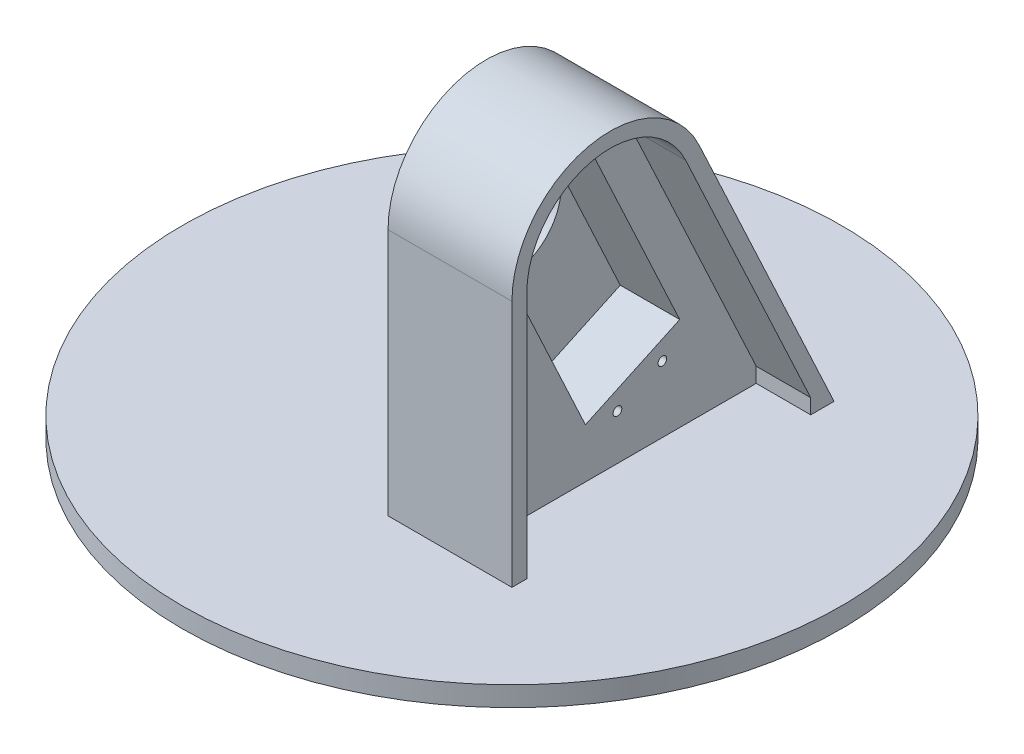
ISO-10303-21;
HEADER;
FILE_DESCRIPTION(('STEP AP214'),'2;1');
FILE_NAME('part.step','',(''),(''),'','','');
FILE_SCHEMA(('AUTOMOTIVE_DESIGN { 1 0 10303 214 1 1 1 1 }'));
ENDSEC;
DATA;
#1=APPLICATION_CONTEXT('core data for automotive mechanical design processes');
#2=APPLICATION_PROTOCOL_DEFINITION('international standard','automotive_design',2000,#1);
#3=PRODUCT_CONTEXT('',#1,'mechanical');
#4=PRODUCT('Part','Part','',(#3));
#5=PRODUCT_RELATED_PRODUCT_CATEGORY('part','',(#4));
#6=PRODUCT_DEFINITION_FORMATION('','',#4);
#7=PRODUCT_DEFINITION_CONTEXT('part definition',#1,'design');
#8=PRODUCT_DEFINITION('design','',#6,#7);
#9=PRODUCT_DEFINITION_SHAPE('','',#8);
#10=(LENGTH_UNIT() NAMED_UNIT(*) SI_UNIT(.MILLI.,.METRE.));
#11=(NAMED_UNIT(*) PLANE_ANGLE_UNIT() SI_UNIT($,.RADIAN.));
#12=(NAMED_UNIT(*) SI_UNIT($,.STERADIAN.) SOLID_ANGLE_UNIT());
#13=UNCERTAINTY_MEASURE_WITH_UNIT(LENGTH_MEASURE(1.E-05),#10,'distance_accuracy_value','');
#14=(GEOMETRIC_REPRESENTATION_CONTEXT(3) GLOBAL_UNCERTAINTY_ASSIGNED_CONTEXT((#13)) GLOBAL_UNIT_ASSIGNED_CONTEXT((#10,
#11,#12)) REPRESENTATION_CONTEXT('',''));
#15=CARTESIAN_POINT('',(0.,0.,0.));
#16=DIRECTION('',(0.,0.,1.));
#17=DIRECTION('',(1.,0.,0.));
#18=AXIS2_PLACEMENT_3D('',#15,#16,#17);
#19=CARTESIAN_POINT('',(0.,8.,0.));
#20=DIRECTION('',(0.,-1.,0.));
#21=DIRECTION('',(0.,0.,-1.));
#22=AXIS2_PLACEMENT_3D('',#19,#20,#21);
#23=PLANE('',#22);
#24=DIRECTION('',(0.,0.,-1.));
#25=VECTOR('',#24,1.);
#26=CARTESIAN_POINT('',(0.,8.,-37.));
#27=LINE('',#26,#25);
#28=CARTESIAN_POINT('',(0.,8.,-27.));
#29=VERTEX_POINT('',#28);
#30=CARTESIAN_POINT('',(0.,8.,-33.));
#31=VERTEX_POINT('',#30);
#32=EDGE_CURVE('E237',#29,#31,#27,.T.);
#33=ORIENTED_EDGE('',*,*,#32,.T.);
#34=DIRECTION('',(1.,0.,0.));
#35=VECTOR('',#34,1.);
#36=CARTESIAN_POINT('',(0.,8.,-33.));
#37=LINE('',#36,#35);
#38=CARTESIAN_POINT('',(-7.5,8.,-33.));
#39=VERTEX_POINT('',#38);
#40=EDGE_CURVE('E228',#39,#31,#37,.T.);
#41=ORIENTED_EDGE('',*,*,#40,.F.);
#42=DIRECTION('',(0.,0.,1.));
#43=VECTOR('',#42,1.);
#44=CARTESIAN_POINT('',(-7.5,8.,-27.));
#45=LINE('',#44,#43);
#46=CARTESIAN_POINT('',(-7.5,8.,-27.));
#47=VERTEX_POINT('',#46);
#48=EDGE_CURVE('E250',#39,#47,#45,.T.);
#49=ORIENTED_EDGE('',*,*,#48,.T.);
#50=DIRECTION('',(1.,0.,0.));
#51=VECTOR('',#50,1.);
#52=CARTESIAN_POINT('',(0.,8.,-27.));
#53=LINE('',#52,#51);
#54=EDGE_CURVE('E253',#47,#29,#53,.T.);
#55=ORIENTED_EDGE('',*,*,#54,.T.);
#56=EDGE_LOOP('',(#33,#41,#49,#55));
#57=FACE_BOUND('',#56,.T.);
#58=ADVANCED_FACE('F39',(#57),#23,.F.);
#59=CARTESIAN_POINT('',(0.,0.,0.));
#60=DIRECTION('',(0.,1.,0.));
#61=DIRECTION('',(0.,0.,1.));
#62=AXIS2_PLACEMENT_3D('',#59,#60,#61);
#63=PLANE('',#62);
#64=CARTESIAN_POINT('',(0.,0.,-7.25));
#65=DIRECTION('',(0.,1.,0.));
#66=DIRECTION('',(0.,0.,1.));
#67=AXIS2_PLACEMENT_3D('',#64,#65,#66);
#68=CIRCLE('',#67,0.875);
#69=CARTESIAN_POINT('',(0.,0.,-6.375));
#70=VERTEX_POINT('',#69);
#71=EDGE_CURVE('E449',#70,#70,#68,.T.);
#72=ORIENTED_EDGE('',*,*,#71,.F.);
#73=EDGE_LOOP('',(#72));
#74=FACE_BOUND('',#73,.T.);
#75=CARTESIAN_POINT('',(0.,0.,7.25));
#76=DIRECTION('',(0.,1.,0.));
#77=DIRECTION('',(0.,0.,1.));
#78=AXIS2_PLACEMENT_3D('',#75,#76,#77);
#79=CIRCLE('',#78,0.875);
#80=CARTESIAN_POINT('',(0.,0.,8.125));
#81=VERTEX_POINT('',#80);
#82=EDGE_CURVE('E462',#81,#81,#79,.T.);
#83=ORIENTED_EDGE('',*,*,#82,.F.);
#84=EDGE_LOOP('',(#83));
#85=FACE_BOUND('',#84,.T.);
#86=CARTESIAN_POINT('',(0.,0.,0.));
#87=DIRECTION('',(0.,1.,0.));
#88=DIRECTION('',(0.,0.,1.));
#89=AXIS2_PLACEMENT_3D('',#86,#87,#88);
#90=CIRCLE('',#89,3.75);
#91=CARTESIAN_POINT('',(0.,0.,3.75));
#92=VERTEX_POINT('',#91);
#93=EDGE_CURVE('E470',#92,#92,#90,.T.);
#94=ORIENTED_EDGE('',*,*,#93,.F.);
#95=EDGE_LOOP('',(#94));
#96=FACE_BOUND('',#95,.T.);
#97=CARTESIAN_POINT('',(0.,0.,0.));
#98=DIRECTION('',(0.,1.,0.));
#99=DIRECTION('',(0.,0.,1.));
#100=AXIS2_PLACEMENT_3D('',#97,#98,#99);
#101=CIRCLE('',#100,66.5);
#102=CARTESIAN_POINT('',(0.,0.,66.5));
#103=VERTEX_POINT('',#102);
#104=EDGE_CURVE('E49',#103,#103,#101,.T.);
#105=ORIENTED_EDGE('',*,*,#104,.T.);
#106=EDGE_LOOP('',(#105));
#107=FACE_BOUND('',#106,.T.);
#108=DIRECTION('',(-1.,0.,0.));
#109=VECTOR('',#108,1.);
#110=CARTESIAN_POINT('',(30.,0.,-35.));
#111=LINE('',#110,#109);
#112=CARTESIAN_POINT('',(30.,0.,-35.));
#113=VERTEX_POINT('',#112);
#114=CARTESIAN_POINT('',(5.,0.,-35.));
#115=VERTEX_POINT('',#114);
#116=EDGE_CURVE('E445',#113,#115,#111,.T.);
#117=ORIENTED_EDGE('',*,*,#116,.F.);
#118=DIRECTION('',(0.,0.,1.));
#119=VECTOR('',#118,1.);
#120=CARTESIAN_POINT('',(30.,0.,0.));
#121=LINE('',#120,#119);
#122=CARTESIAN_POINT('',(30.,0.,-30.2909432686475));
#123=VERTEX_POINT('',#122);
#124=EDGE_CURVE('E414',#113,#123,#121,.T.);
#125=ORIENTED_EDGE('',*,*,#124,.T.);
#126=DIRECTION('',(1.,0.,0.));
#127=VECTOR('',#126,1.);
#128=CARTESIAN_POINT('',(19.,0.,-30.2909432686475));
#129=LINE('',#128,#127);
#130=CARTESIAN_POINT('',(19.,0.,-30.2909432686475));
#131=VERTEX_POINT('',#130);
#132=EDGE_CURVE('E384',#131,#123,#129,.T.);
#133=ORIENTED_EDGE('',*,*,#132,.F.);
#134=DIRECTION('',(0.,0.,-1.));
#135=VECTOR('',#134,1.);
#136=CARTESIAN_POINT('',(19.,0.,27.));
#137=LINE('',#136,#135);
#138=CARTESIAN_POINT('',(19.,0.,27.));
#139=VERTEX_POINT('',#138);
#140=EDGE_CURVE('E364',#139,#131,#137,.T.);
#141=ORIENTED_EDGE('',*,*,#140,.F.);
#142=DIRECTION('',(1.,0.,0.));
#143=VECTOR('',#142,1.);
#144=CARTESIAN_POINT('',(19.,0.,27.));
#145=LINE('',#144,#143);
#146=CARTESIAN_POINT('',(30.,0.,27.));
#147=VERTEX_POINT('',#146);
#148=EDGE_CURVE('E399',#139,#147,#145,.T.);
#149=ORIENTED_EDGE('',*,*,#148,.T.);
#150=CARTESIAN_POINT('',(30.,0.,30.));
#151=VERTEX_POINT('',#150);
#152=EDGE_CURVE('E419',#147,#151,#121,.T.);
#153=ORIENTED_EDGE('',*,*,#152,.T.);
#154=DIRECTION('',(-1.,0.,0.));
#155=VECTOR('',#154,1.);
#156=CARTESIAN_POINT('',(30.,0.,30.));
#157=LINE('',#156,#155);
#158=CARTESIAN_POINT('',(5.,0.,30.));
#159=VERTEX_POINT('',#158);
#160=EDGE_CURVE('E430',#151,#159,#157,.T.);
#161=ORIENTED_EDGE('',*,*,#160,.T.);
#162=DIRECTION('',(0.,0.,-1.));
#163=VECTOR('',#162,1.);
#164=CARTESIAN_POINT('',(5.,0.,0.));
#165=LINE('',#164,#163);
#166=EDGE_CURVE('E442',#159,#115,#165,.T.);
#167=ORIENTED_EDGE('',*,*,#166,.T.);
#168=EDGE_LOOP('',(#117,#125,#133,#141,#149,#153,#161,#167));
#169=FACE_BOUND('',#168,.T.);
#170=DIRECTION('',(-1.,0.,0.));
#171=VECTOR('',#170,1.);
#172=CARTESIAN_POINT('',(-7.5,0.,-37.));
#173=LINE('',#172,#171);
#174=CARTESIAN_POINT('',(0.,0.,-37.));
#175=VERTEX_POINT('',#174);
#176=CARTESIAN_POINT('',(-7.5,0.,-37.));
#177=VERTEX_POINT('',#176);
#178=EDGE_CURVE('E259',#175,#177,#173,.T.);
#179=ORIENTED_EDGE('',*,*,#178,.F.);
#180=DIRECTION('',(0.,0.,-1.));
#181=VECTOR('',#180,1.);
#182=CARTESIAN_POINT('',(0.,0.,-37.));
#183=LINE('',#182,#181);
#184=CARTESIAN_POINT('',(0.,0.,-27.));
#185=VERTEX_POINT('',#184);
#186=EDGE_CURVE('E218',#185,#175,#183,.T.);
#187=ORIENTED_EDGE('',*,*,#186,.F.);
#188=DIRECTION('',(1.,0.,0.));
#189=VECTOR('',#188,1.);
#190=CARTESIAN_POINT('',(0.,0.,-27.));
#191=LINE('',#190,#189);
#192=CARTESIAN_POINT('',(-7.5,0.,-27.));
#193=VERTEX_POINT('',#192);
#194=EDGE_CURVE('E238',#193,#185,#191,.T.);
#195=ORIENTED_EDGE('',*,*,#194,.F.);
#196=DIRECTION('',(0.,0.,1.));
#197=VECTOR('',#196,1.);
#198=CARTESIAN_POINT('',(-7.5,0.,-27.));
#199=LINE('',#198,#197);
#200=EDGE_CURVE('E244',#177,#193,#199,.T.);
#201=ORIENTED_EDGE('',*,*,#200,.F.);
#202=EDGE_LOOP('',(#179,#187,#195,#201));
#203=FACE_BOUND('',#202,.T.);
#204=ADVANCED_FACE('F484',(#74,#85,#96,#107,#169,#203),#63,.T.);
#205=CARTESIAN_POINT('',(7.,0.,0.));
#206=DIRECTION('',(1.,0.,0.));
#207=DIRECTION('',(0.,0.,-1.));
#208=AXIS2_PLACEMENT_3D('',#205,#206,#207);
#209=PLANE('',#208);
#210=CARTESIAN_POINT('',(7.,42.0798792528952,7.54627648783785));
#211=DIRECTION('',(1.,0.,0.));
#212=DIRECTION('',(0.,0.,-1.));
#213=AXIS2_PLACEMENT_3D('',#210,#211,#212);
#214=CIRCLE('',#213,10.5);
#215=CARTESIAN_POINT('',(7.,46.5173710011725,-1.96995527604699));
#216=VERTEX_POINT('',#215);
#217=CARTESIAN_POINT('',(7.,51.59611101678,11.9837682361152));
#218=VERTEX_POINT('',#217);
#219=EDGE_CURVE('E278',#216,#218,#214,.T.);
#220=ORIENTED_EDGE('',*,*,#219,.F.);
#221=DIRECTION('',(0.,-0.906307787036651,-0.422618261740697));
#222=VECTOR('',#221,1.);
#223=CARTESIAN_POINT('',(7.,9.06282728941771,-19.4352958415393));
#224=LINE('',#223,#222);
#225=CARTESIAN_POINT('',(7.,56.0336027650573,2.46753647223033));
#226=VERTEX_POINT('',#225);
#227=EDGE_CURVE('E321',#226,#216,#224,.T.);
#228=ORIENTED_EDGE('',*,*,#227,.F.);
#229=DIRECTION('',(0.,0.422618261740697,-0.906307787036651));
#230=VECTOR('',#229,1.);
#231=CARTESIAN_POINT('',(7.,46.9707754756396,21.9028323137696));
#232=LINE('',#231,#230);
#233=EDGE_CURVE('E325',#218,#226,#232,.T.);
#234=ORIENTED_EDGE('',*,*,#233,.F.);
#235=EDGE_LOOP('',(#220,#228,#234));
#236=FACE_BOUND('',#235,.T.);
#237=ADVANCED_FACE('F507',(#236),#209,.T.);
#238=CARTESIAN_POINT('',(7.,37.6423875046179,17.0625082517227));
#239=VERTEX_POINT('',#238);
#240=EDGE_CURVE('E281',#218,#239,#214,.T.);
#241=ORIENTED_EDGE('',*,*,#240,.F.);
#242=CARTESIAN_POINT('',(7.,47.1586192685027,21.5));
#243=VERTEX_POINT('',#242);
#244=EDGE_CURVE('E326',#243,#218,#232,.T.);
#245=ORIENTED_EDGE('',*,*,#244,.F.);
#246=DIRECTION('',(0.,0.906307787036651,0.422618261740697));
#247=VECTOR('',#246,1.);
#248=CARTESIAN_POINT('',(7.,0.187843792863068,-0.402832313769615));
#249=LINE('',#248,#247);
#250=EDGE_CURVE('E330',#239,#243,#249,.T.);
#251=ORIENTED_EDGE('',*,*,#250,.F.);
#252=EDGE_LOOP('',(#241,#245,#251));
#253=FACE_BOUND('',#252,.T.);
#254=ADVANCED_FACE('F498',(#253),#209,.T.);
#255=CARTESIAN_POINT('',(19.,50.,10.1820601440891));
#256=DIRECTION('',(1.,0.,0.));
#257=DIRECTION('',(0.,0.,-1.));
#258=AXIS2_PLACEMENT_3D('',#255,#256,#257);
#259=PLANE('',#258);
#260=CARTESIAN_POINT('',(19.,52.6550969627048,17.9944710873909));
#261=DIRECTION('',(1.,0.,0.));
#262=DIRECTION('',(0.,0.,-1.));
#263=AXIS2_PLACEMENT_3D('',#260,#261,#262);
#264=CIRCLE('',#263,0.875000000000002);
#265=CARTESIAN_POINT('',(19.,52.6550969627048,17.1194710873909));
#266=VERTEX_POINT('',#265);
#267=EDGE_CURVE('E287',#266,#266,#264,.T.);
#268=ORIENTED_EDGE('',*,*,#267,.F.);
#269=EDGE_LOOP('',(#268));
#270=FACE_BOUND('',#269,.T.);
#271=CARTESIAN_POINT('',(19.,56.8812795801118,8.93139321702436));
#272=DIRECTION('',(1.,0.,0.));
#273=DIRECTION('',(0.,0.,-1.));
#274=AXIS2_PLACEMENT_3D('',#271,#272,#273);
#275=CIRCLE('',#274,0.875);
#276=CARTESIAN_POINT('',(19.,56.8812795801118,8.05639321702436));
#277=VERTEX_POINT('',#276);
#278=EDGE_CURVE('E291',#277,#277,#275,.T.);
#279=ORIENTED_EDGE('',*,*,#278,.F.);
#280=EDGE_LOOP('',(#279));
#281=FACE_BOUND('',#280,.T.);
#282=CARTESIAN_POINT('',(19.,9.15232318494556,-2.29120547616262));
#283=DIRECTION('',(1.,0.,0.));
#284=DIRECTION('',(0.,0.,-1.));
#285=AXIS2_PLACEMENT_3D('',#282,#283,#284);
#286=CIRCLE('',#285,0.875);
#287=CARTESIAN_POINT('',(19.,9.15232318494556,-3.16620547616262));
#288=VERTEX_POINT('',#287);
#289=EDGE_CURVE('E299',#288,#288,#286,.T.);
#290=ORIENTED_EDGE('',*,*,#289,.F.);
#291=EDGE_LOOP('',(#290));
#292=FACE_BOUND('',#291,.T.);
#293=CARTESIAN_POINT('',(19.,13.3785058023525,-11.3542833465291));
#294=DIRECTION('',(1.,0.,0.));
#295=DIRECTION('',(0.,0.,-1.));
#296=AXIS2_PLACEMENT_3D('',#293,#294,#295);
#297=CIRCLE('',#296,0.875);
#298=CARTESIAN_POINT('',(19.,13.3785058023525,-12.2292833465291));
#299=VERTEX_POINT('',#298);
#300=EDGE_CURVE('E307',#299,#299,#297,.T.);
#301=ORIENTED_EDGE('',*,*,#300,.F.);
#302=EDGE_LOOP('',(#301));
#303=FACE_BOUND('',#302,.T.);
#304=ORIENTED_EDGE('',*,*,#140,.T.);
#305=DIRECTION('',(0.,1.,0.));
#306=VECTOR('',#305,1.);
#307=CARTESIAN_POINT('',(19.,0.,-30.2909432686475));
#308=LINE('',#307,#306);
#309=CARTESIAN_POINT('',(19.,3.,-30.2909432686475));
#310=VERTEX_POINT('',#309);
#311=EDGE_CURVE('E368',#131,#310,#308,.T.);
#312=ORIENTED_EDGE('',*,*,#311,.T.);
#313=DIRECTION('',(0.,0.906307787036648,0.422618261740704));
#314=VECTOR('',#313,1.);
#315=CARTESIAN_POINT('',(19.,3.,-30.2909432686475));
#316=LINE('',#315,#314);
#317=CARTESIAN_POINT('',(19.,57.1075685079648,-5.06016970923695));
#318=VERTEX_POINT('',#317);
#319=EDGE_CURVE('E373',#310,#318,#316,.T.);
#320=ORIENTED_EDGE('',*,*,#319,.T.);
#321=CARTESIAN_POINT('',(19.,50.,10.1820601440891));
#322=DIRECTION('',(1.,0.,0.));
#323=DIRECTION('',(0.,0.,-1.));
#324=AXIS2_PLACEMENT_3D('',#321,#322,#323);
#325=CIRCLE('',#324,16.8179398559109);
#326=CARTESIAN_POINT('',(19.,50.,27.));
#327=VERTEX_POINT('',#326);
#328=EDGE_CURVE('E377',#318,#327,#325,.T.);
#329=ORIENTED_EDGE('',*,*,#328,.T.);
#330=DIRECTION('',(0.,-1.,0.));
#331=VECTOR('',#330,1.);
#332=CARTESIAN_POINT('',(19.,50.,27.));
#333=LINE('',#332,#331);
#334=EDGE_CURVE('E381',#327,#139,#333,.T.);
#335=ORIENTED_EDGE('',*,*,#334,.T.);
#336=EDGE_LOOP('',(#304,#312,#320,#329,#335));
#337=FACE_BOUND('',#336,.T.);
#338=DIRECTION('',(0.,-0.906307787036651,-0.422618261740697));
#339=VECTOR('',#338,1.);
#340=CARTESIAN_POINT('',(19.,9.06282728941771,-19.4352958415393));
#341=LINE('',#340,#339);
#342=CARTESIAN_POINT('',(19.,56.0336027650573,2.46753647223033));
#343=VERTEX_POINT('',#342);
#344=CARTESIAN_POINT('',(19.,18.8749834965546,-14.8598122591383));
#345=VERTEX_POINT('',#344);
#346=EDGE_CURVE('E339',#343,#345,#341,.T.);
#347=ORIENTED_EDGE('',*,*,#346,.T.);
#348=DIRECTION('',(0.,-0.422618261740697,0.906307787036651));
#349=VECTOR('',#348,1.);
#350=CARTESIAN_POINT('',(19.,9.81215620713694,4.57548358240103));
#351=LINE('',#350,#349);
#352=CARTESIAN_POINT('',(19.,10.,4.17265126863141));
#353=VERTEX_POINT('',#352);
#354=EDGE_CURVE('E286',#345,#353,#351,.T.);
#355=ORIENTED_EDGE('',*,*,#354,.T.);
#356=DIRECTION('',(0.,0.906307787036651,0.422618261740697));
#357=VECTOR('',#356,1.);
#358=CARTESIAN_POINT('',(19.,0.187843792863068,-0.402832313769615));
#359=LINE('',#358,#357);
#360=CARTESIAN_POINT('',(19.,47.1586192685027,21.5));
#361=VERTEX_POINT('',#360);
#362=EDGE_CURVE('E320',#353,#361,#359,.T.);
#363=ORIENTED_EDGE('',*,*,#362,.T.);
#364=DIRECTION('',(0.,0.422618261740697,-0.906307787036651));
#365=VECTOR('',#364,1.);
#366=CARTESIAN_POINT('',(19.,46.9707754756396,21.9028323137696));
#367=LINE('',#366,#365);
#368=EDGE_CURVE('E343',#361,#343,#367,.T.);
#369=ORIENTED_EDGE('',*,*,#368,.T.);
#370=EDGE_LOOP('',(#347,#355,#363,#369));
#371=FACE_BOUND('',#370,.T.);
#372=ADVANCED_FACE('F489',(#270,#281,#292,#303,#337,#371),#259,.T.);
#373=CARTESIAN_POINT('',(0.,-4.,0.));
#374=DIRECTION('',(0.,1.,0.));
#375=DIRECTION('',(0.,0.,1.));
#376=AXIS2_PLACEMENT_3D('',#373,#374,#375);
#377=CYLINDRICAL_SURFACE('',#376,66.5);
#378=CARTESIAN_POINT('',(0.,-4.,0.));
#379=DIRECTION('',(0.,1.,0.));
#380=DIRECTION('',(0.,0.,1.));
#381=AXIS2_PLACEMENT_3D('',#378,#379,#380);
#382=CIRCLE('',#381,66.5);
#383=CARTESIAN_POINT('',(0.,-4.,66.5));
#384=VERTEX_POINT('',#383);
#385=EDGE_CURVE('E11',#384,#384,#382,.T.);
#386=ORIENTED_EDGE('',*,*,#385,.T.);
#387=EDGE_LOOP('',(#386));
#388=FACE_BOUND('',#387,.T.);
#389=ORIENTED_EDGE('',*,*,#104,.F.);
#390=EDGE_LOOP('',(#389));
#391=FACE_BOUND('',#390,.T.);
#392=ADVANCED_FACE('F41',(#388,#391),#377,.T.);
#393=CARTESIAN_POINT('',(0.,-4.,0.));
#394=DIRECTION('',(0.,1.,0.));
#395=DIRECTION('',(0.,0.,1.));
#396=AXIS2_PLACEMENT_3D('',#393,#394,#395);
#397=PLANE('',#396);
#398=CARTESIAN_POINT('',(0.,-4.,-7.25));
#399=DIRECTION('',(0.,1.,0.));
#400=DIRECTION('',(0.,0.,1.));
#401=AXIS2_PLACEMENT_3D('',#398,#399,#400);
#402=CIRCLE('',#401,0.875);
#403=CARTESIAN_POINT('',(0.,-4.,-6.375));
#404=VERTEX_POINT('',#403);
#405=EDGE_CURVE('E458',#404,#404,#402,.T.);
#406=ORIENTED_EDGE('',*,*,#405,.T.);
#407=EDGE_LOOP('',(#406));
#408=FACE_BOUND('',#407,.T.);
#409=CARTESIAN_POINT('',(0.,-4.,7.25));
#410=DIRECTION('',(0.,1.,0.));
#411=DIRECTION('',(0.,0.,1.));
#412=AXIS2_PLACEMENT_3D('',#409,#410,#411);
#413=CIRCLE('',#412,0.875);
#414=CARTESIAN_POINT('',(0.,-4.,8.125));
#415=VERTEX_POINT('',#414);
#416=EDGE_CURVE('E466',#415,#415,#413,.T.);
#417=ORIENTED_EDGE('',*,*,#416,.T.);
#418=EDGE_LOOP('',(#417));
#419=FACE_BOUND('',#418,.T.);
#420=CARTESIAN_POINT('',(0.,-4.,0.));
#421=DIRECTION('',(0.,1.,0.));
#422=DIRECTION('',(0.,0.,1.));
#423=AXIS2_PLACEMENT_3D('',#420,#421,#422);
#424=CIRCLE('',#423,3.75);
#425=CARTESIAN_POINT('',(0.,-4.,3.75));
#426=VERTEX_POINT('',#425);
#427=EDGE_CURVE('E474',#426,#426,#424,.T.);
#428=ORIENTED_EDGE('',*,*,#427,.T.);
#429=EDGE_LOOP('',(#428));
#430=FACE_BOUND('',#429,.T.);
#431=ORIENTED_EDGE('',*,*,#385,.F.);
#432=EDGE_LOOP('',(#431));
#433=FACE_BOUND('',#432,.T.);
#434=ADVANCED_FACE('F488',(#408,#419,#430,#433),#397,.F.);
#435=CARTESIAN_POINT('',(0.,-4.,0.));
#436=DIRECTION('',(0.,1.,0.));
#437=DIRECTION('',(0.,0.,1.));
#438=AXIS2_PLACEMENT_3D('',#435,#436,#437);
#439=CYLINDRICAL_SURFACE('',#438,3.75);
#440=ORIENTED_EDGE('',*,*,#427,.F.);
#441=EDGE_LOOP('',(#440));
#442=FACE_BOUND('',#441,.T.);
#443=ORIENTED_EDGE('',*,*,#93,.T.);
#444=EDGE_LOOP('',(#443));
#445=FACE_BOUND('',#444,.T.);
#446=ADVANCED_FACE('F495',(#442,#445),#439,.F.);
#447=CARTESIAN_POINT('',(0.,-4.,7.25));
#448=DIRECTION('',(0.,1.,0.));
#449=DIRECTION('',(0.,0.,1.));
#450=AXIS2_PLACEMENT_3D('',#447,#448,#449);
#451=CYLINDRICAL_SURFACE('',#450,0.875);
#452=ORIENTED_EDGE('',*,*,#416,.F.);
#453=EDGE_LOOP('',(#452));
#454=FACE_BOUND('',#453,.T.);
#455=ORIENTED_EDGE('',*,*,#82,.T.);
#456=EDGE_LOOP('',(#455));
#457=FACE_BOUND('',#456,.T.);
#458=ADVANCED_FACE('F627',(#454,#457),#451,.F.);
#459=CARTESIAN_POINT('',(0.,-4.,-7.25));
#460=DIRECTION('',(0.,1.,0.));
#461=DIRECTION('',(0.,0.,1.));
#462=AXIS2_PLACEMENT_3D('',#459,#460,#461);
#463=CYLINDRICAL_SURFACE('',#462,0.875);
#464=ORIENTED_EDGE('',*,*,#405,.F.);
#465=EDGE_LOOP('',(#464));
#466=FACE_BOUND('',#465,.T.);
#467=ORIENTED_EDGE('',*,*,#71,.T.);
#468=EDGE_LOOP('',(#467));
#469=FACE_BOUND('',#468,.T.);
#470=ADVANCED_FACE('F617',(#466,#469),#463,.F.);
#471=CARTESIAN_POINT('',(30.,0.,-35.));
#472=DIRECTION('',(0.,-0.422618261740704,0.906307787036648));
#473=DIRECTION('',(0.,-0.906307787036648,-0.422618261740704));
#474=AXIS2_PLACEMENT_3D('',#471,#472,#473);
#475=PLANE('',#474);
#476=DIRECTION('',(0.,0.906307787036648,0.422618261740704));
#477=VECTOR('',#476,1.);
#478=CARTESIAN_POINT('',(5.,0.,-35.));
#479=LINE('',#478,#477);
#480=CARTESIAN_POINT('',(5.,58.3754232931869,-7.77909307034691));
#481=VERTEX_POINT('',#480);
#482=EDGE_CURVE('E438',#115,#481,#479,.T.);
#483=ORIENTED_EDGE('',*,*,#482,.T.);
#484=DIRECTION('',(-1.,0.,0.));
#485=VECTOR('',#484,1.);
#486=CARTESIAN_POINT('',(30.,58.3754232931869,-7.77909307034691));
#487=LINE('',#486,#485);
#488=CARTESIAN_POINT('',(30.,58.3754232931869,-7.77909307034691));
#489=VERTEX_POINT('',#488);
#490=EDGE_CURVE('E450',#489,#481,#487,.T.);
#491=ORIENTED_EDGE('',*,*,#490,.F.);
#492=DIRECTION('',(0.,0.906307787036648,0.422618261740704));
#493=VECTOR('',#492,1.);
#494=CARTESIAN_POINT('',(30.,0.,-35.));
#495=LINE('',#494,#493);
#496=EDGE_CURVE('E427',#113,#489,#495,.T.);
#497=ORIENTED_EDGE('',*,*,#496,.F.);
#498=ORIENTED_EDGE('',*,*,#116,.T.);
#499=EDGE_LOOP('',(#483,#491,#497,#498));
#500=FACE_BOUND('',#499,.T.);
#501=ADVANCED_FACE('F613',(#500),#475,.F.);
#502=CARTESIAN_POINT('',(30.,50.,10.1820601440891));
#503=DIRECTION('',(-1.,0.,0.));
#504=DIRECTION('',(0.,0.,1.));
#505=AXIS2_PLACEMENT_3D('',#502,#503,#504);
#506=CYLINDRICAL_SURFACE('',#505,19.8179398559109);
#507=CARTESIAN_POINT('',(5.,50.,10.1820601440891));
#508=DIRECTION('',(-1.,0.,0.));
#509=DIRECTION('',(0.,0.,1.));
#510=AXIS2_PLACEMENT_3D('',#507,#508,#509);
#511=CIRCLE('',#510,19.8179398559109);
#512=CARTESIAN_POINT('',(5.,50.,30.));
#513=VERTEX_POINT('',#512);
#514=EDGE_CURVE('E434',#513,#481,#511,.T.);
#515=ORIENTED_EDGE('',*,*,#514,.F.);
#516=DIRECTION('',(-1.,0.,0.));
#517=VECTOR('',#516,1.);
#518=CARTESIAN_POINT('',(30.,50.,30.));
#519=LINE('',#518,#517);
#520=CARTESIAN_POINT('',(30.,50.,30.));
#521=VERTEX_POINT('',#520);
#522=EDGE_CURVE('E453',#521,#513,#519,.T.);
#523=ORIENTED_EDGE('',*,*,#522,.F.);
#524=CARTESIAN_POINT('',(30.,50.,10.1820601440891));
#525=DIRECTION('',(-1.,0.,0.));
#526=DIRECTION('',(0.,0.,1.));
#527=AXIS2_PLACEMENT_3D('',#524,#525,#526);
#528=CIRCLE('',#527,19.8179398559109);
#529=EDGE_CURVE('E423',#521,#489,#528,.T.);
#530=ORIENTED_EDGE('',*,*,#529,.T.);
#531=ORIENTED_EDGE('',*,*,#490,.T.);
#532=EDGE_LOOP('',(#515,#523,#530,#531));
#533=FACE_BOUND('',#532,.T.);
#534=ADVANCED_FACE('F616',(#533),#506,.T.);
#535=CARTESIAN_POINT('',(30.,0.,30.));
#536=DIRECTION('',(0.,0.,1.));
#537=DIRECTION('',(1.,0.,0.));
#538=AXIS2_PLACEMENT_3D('',#535,#536,#537);
#539=PLANE('',#538);
#540=DIRECTION('',(0.,1.,0.));
#541=VECTOR('',#540,1.);
#542=CARTESIAN_POINT('',(5.,0.,30.));
#543=LINE('',#542,#541);
#544=EDGE_CURVE('E402',#159,#513,#543,.T.);
#545=ORIENTED_EDGE('',*,*,#544,.F.);
#546=ORIENTED_EDGE('',*,*,#160,.F.);
#547=DIRECTION('',(0.,1.,0.));
#548=VECTOR('',#547,1.);
#549=CARTESIAN_POINT('',(30.,0.,30.));
#550=LINE('',#549,#548);
#551=EDGE_CURVE('E418',#151,#521,#550,.T.);
#552=ORIENTED_EDGE('',*,*,#551,.T.);
#553=ORIENTED_EDGE('',*,*,#522,.T.);
#554=EDGE_LOOP('',(#545,#546,#552,#553));
#555=FACE_BOUND('',#554,.T.);
#556=ADVANCED_FACE('F608',(#555),#539,.T.);
#557=CARTESIAN_POINT('',(30.,50.,10.1820601440891));
#558=DIRECTION('',(-1.,0.,0.));
#559=DIRECTION('',(0.,0.,1.));
#560=AXIS2_PLACEMENT_3D('',#557,#558,#559);
#561=PLANE('',#560);
#562=ORIENTED_EDGE('',*,*,#152,.F.);
#563=DIRECTION('',(0.,-1.,0.));
#564=VECTOR('',#563,1.);
#565=CARTESIAN_POINT('',(30.,3.,27.));
#566=LINE('',#565,#564);
#567=CARTESIAN_POINT('',(30.,50.,27.));
#568=VERTEX_POINT('',#567);
#569=EDGE_CURVE('E369',#568,#147,#566,.T.);
#570=ORIENTED_EDGE('',*,*,#569,.F.);
#571=CARTESIAN_POINT('',(30.,50.,10.1820601440891));
#572=DIRECTION('',(1.,0.,0.));
#573=DIRECTION('',(0.,0.,-1.));
#574=AXIS2_PLACEMENT_3D('',#571,#572,#573);
#575=CIRCLE('',#574,16.8179398559109);
#576=CARTESIAN_POINT('',(30.,57.1075685079648,-5.06016970923695));
#577=VERTEX_POINT('',#576);
#578=EDGE_CURVE('E392',#577,#568,#575,.T.);
#579=ORIENTED_EDGE('',*,*,#578,.F.);
#580=DIRECTION('',(0.,0.906307787036648,0.422618261740704));
#581=VECTOR('',#580,1.);
#582=CARTESIAN_POINT('',(30.,3.,-30.2909432686475));
#583=LINE('',#582,#581);
#584=CARTESIAN_POINT('',(30.,3.,-30.2909432686475));
#585=VERTEX_POINT('',#584);
#586=EDGE_CURVE('E388',#585,#577,#583,.T.);
#587=ORIENTED_EDGE('',*,*,#586,.F.);
#588=DIRECTION('',(0.,1.,0.));
#589=VECTOR('',#588,1.);
#590=CARTESIAN_POINT('',(30.,0.,-30.2909432686475));
#591=LINE('',#590,#589);
#592=EDGE_CURVE('E354',#123,#585,#591,.T.);
#593=ORIENTED_EDGE('',*,*,#592,.F.);
#594=ORIENTED_EDGE('',*,*,#124,.F.);
#595=ORIENTED_EDGE('',*,*,#496,.T.);
#596=ORIENTED_EDGE('',*,*,#529,.F.);
#597=ORIENTED_EDGE('',*,*,#551,.F.);
#598=EDGE_LOOP('',(#562,#570,#579,#587,#593,#594,#595,#596,#597));
#599=FACE_BOUND('',#598,.T.);
#600=ADVANCED_FACE('F605',(#599),#561,.F.);
#601=CARTESIAN_POINT('',(5.,50.,10.1820601440891));
#602=DIRECTION('',(-1.,0.,0.));
#603=DIRECTION('',(0.,0.,1.));
#604=AXIS2_PLACEMENT_3D('',#601,#602,#603);
#605=PLANE('',#604);
#606=CARTESIAN_POINT('',(5.,42.0798792528952,7.54627648783785));
#607=DIRECTION('',(-1.,0.,0.));
#608=DIRECTION('',(0.,0.,1.));
#609=AXIS2_PLACEMENT_3D('',#606,#607,#608);
#610=CIRCLE('',#609,10.5);
#611=CARTESIAN_POINT('',(5.,42.0798792528952,18.0462764878379));
#612=VERTEX_POINT('',#611);
#613=EDGE_CURVE('E43',#612,#612,#610,.T.);
#614=ORIENTED_EDGE('',*,*,#613,.F.);
#615=EDGE_LOOP('',(#614));
#616=FACE_BOUND('',#615,.T.);
#617=ORIENTED_EDGE('',*,*,#166,.F.);
#618=ORIENTED_EDGE('',*,*,#544,.T.);
#619=ORIENTED_EDGE('',*,*,#514,.T.);
#620=ORIENTED_EDGE('',*,*,#482,.F.);
#621=EDGE_LOOP('',(#617,#618,#619,#620));
#622=FACE_BOUND('',#621,.T.);
#623=ADVANCED_FACE('F593',(#616,#622),#605,.T.);
#624=CARTESIAN_POINT('',(19.,3.,27.));
#625=DIRECTION('',(0.,0.,1.));
#626=DIRECTION('',(0.,-1.,0.));
#627=AXIS2_PLACEMENT_3D('',#624,#625,#626);
#628=PLANE('',#627);
#629=ORIENTED_EDGE('',*,*,#569,.T.);
#630=ORIENTED_EDGE('',*,*,#148,.F.);
#631=ORIENTED_EDGE('',*,*,#334,.F.);
#632=DIRECTION('',(1.,0.,0.));
#633=VECTOR('',#632,1.);
#634=CARTESIAN_POINT('',(19.,50.,27.));
#635=LINE('',#634,#633);
#636=EDGE_CURVE('E403',#327,#568,#635,.T.);
#637=ORIENTED_EDGE('',*,*,#636,.T.);
#638=EDGE_LOOP('',(#629,#630,#631,#637));
#639=FACE_BOUND('',#638,.T.);
#640=ADVANCED_FACE('F589',(#639),#628,.F.);
#641=CARTESIAN_POINT('',(19.,50.,10.1820601440891));
#642=DIRECTION('',(1.,0.,0.));
#643=DIRECTION('',(0.,0.,-1.));
#644=AXIS2_PLACEMENT_3D('',#641,#642,#643);
#645=CYLINDRICAL_SURFACE('',#644,16.8179398559109);
#646=ORIENTED_EDGE('',*,*,#578,.T.);
#647=ORIENTED_EDGE('',*,*,#636,.F.);
#648=ORIENTED_EDGE('',*,*,#328,.F.);
#649=DIRECTION('',(1.,0.,0.));
#650=VECTOR('',#649,1.);
#651=CARTESIAN_POINT('',(19.,57.1075685079648,-5.06016970923695));
#652=LINE('',#651,#650);
#653=EDGE_CURVE('E406',#318,#577,#652,.T.);
#654=ORIENTED_EDGE('',*,*,#653,.T.);
#655=EDGE_LOOP('',(#646,#647,#648,#654));
#656=FACE_BOUND('',#655,.T.);
#657=ADVANCED_FACE('F592',(#656),#645,.F.);
#658=CARTESIAN_POINT('',(19.,3.,-30.2909432686475));
#659=DIRECTION('',(0.,0.422618261740704,-0.906307787036648));
#660=DIRECTION('',(0.,0.906307787036648,0.422618261740704));
#661=AXIS2_PLACEMENT_3D('',#658,#659,#660);
#662=PLANE('',#661);
#663=ORIENTED_EDGE('',*,*,#586,.T.);
#664=ORIENTED_EDGE('',*,*,#653,.F.);
#665=ORIENTED_EDGE('',*,*,#319,.F.);
#666=DIRECTION('',(1.,0.,0.));
#667=VECTOR('',#666,1.);
#668=CARTESIAN_POINT('',(19.,3.,-30.2909432686475));
#669=LINE('',#668,#667);
#670=EDGE_CURVE('E409',#310,#585,#669,.T.);
#671=ORIENTED_EDGE('',*,*,#670,.T.);
#672=EDGE_LOOP('',(#663,#664,#665,#671));
#673=FACE_BOUND('',#672,.T.);
#674=ADVANCED_FACE('F597',(#673),#662,.F.);
#675=CARTESIAN_POINT('',(19.,0.,-30.2909432686475));
#676=DIRECTION('',(0.,0.,-1.));
#677=DIRECTION('',(-1.,0.,0.));
#678=AXIS2_PLACEMENT_3D('',#675,#676,#677);
#679=PLANE('',#678);
#680=ORIENTED_EDGE('',*,*,#592,.T.);
#681=ORIENTED_EDGE('',*,*,#670,.F.);
#682=ORIENTED_EDGE('',*,*,#311,.F.);
#683=ORIENTED_EDGE('',*,*,#132,.T.);
#684=EDGE_LOOP('',(#680,#681,#682,#683));
#685=FACE_BOUND('',#684,.T.);
#686=ADVANCED_FACE('F586',(#685),#679,.F.);
#687=CARTESIAN_POINT('',(7.,9.81215620713694,4.57548358240103));
#688=DIRECTION('',(0.,0.906307787036651,0.422618261740697));
#689=DIRECTION('',(0.,-0.422618261740698,0.906307787036651));
#690=AXIS2_PLACEMENT_3D('',#687,#688,#689);
#691=PLANE('',#690);
#692=ORIENTED_EDGE('',*,*,#354,.F.);
#693=DIRECTION('',(1.,0.,0.));
#694=VECTOR('',#693,1.);
#695=CARTESIAN_POINT('',(7.,18.8749834965546,-14.8598122591383));
#696=LINE('',#695,#694);
#697=CARTESIAN_POINT('',(7.,18.8749834965546,-14.8598122591383));
#698=VERTEX_POINT('',#697);
#699=EDGE_CURVE('E335',#698,#345,#696,.T.);
#700=ORIENTED_EDGE('',*,*,#699,.F.);
#701=DIRECTION('',(0.,-0.422618261740697,0.906307787036651));
#702=VECTOR('',#701,1.);
#703=CARTESIAN_POINT('',(7.,9.81215620713694,4.57548358240103));
#704=LINE('',#703,#702);
#705=CARTESIAN_POINT('',(7.,10.,4.17265126863141));
#706=VERTEX_POINT('',#705);
#707=EDGE_CURVE('E315',#698,#706,#704,.T.);
#708=ORIENTED_EDGE('',*,*,#707,.T.);
#709=DIRECTION('',(1.,0.,0.));
#710=VECTOR('',#709,1.);
#711=CARTESIAN_POINT('',(7.,10.,4.17265126863141));
#712=LINE('',#711,#710);
#713=EDGE_CURVE('E350',#706,#353,#712,.T.);
#714=ORIENTED_EDGE('',*,*,#713,.T.);
#715=EDGE_LOOP('',(#692,#700,#708,#714));
#716=FACE_BOUND('',#715,.T.);
#717=ADVANCED_FACE('F577',(#716),#691,.T.);
#718=CARTESIAN_POINT('',(7.,0.187843792863068,-0.402832313769615));
#719=DIRECTION('',(0.,0.422618261740697,-0.906307787036651));
#720=DIRECTION('',(0.,0.906307787036651,0.422618261740697));
#721=AXIS2_PLACEMENT_3D('',#718,#719,#720);
#722=PLANE('',#721);
#723=ORIENTED_EDGE('',*,*,#362,.F.);
#724=ORIENTED_EDGE('',*,*,#713,.F.);
#725=EDGE_CURVE('E331',#706,#239,#249,.T.);
#726=ORIENTED_EDGE('',*,*,#725,.T.);
#727=ORIENTED_EDGE('',*,*,#250,.T.);
#728=DIRECTION('',(1.,0.,0.));
#729=VECTOR('',#728,1.);
#730=CARTESIAN_POINT('',(7.,47.1586192685027,21.5));
#731=LINE('',#730,#729);
#732=EDGE_CURVE('E355',#243,#361,#731,.T.);
#733=ORIENTED_EDGE('',*,*,#732,.T.);
#734=EDGE_LOOP('',(#723,#724,#726,#727,#733));
#735=FACE_BOUND('',#734,.T.);
#736=ADVANCED_FACE('F573',(#735),#722,.T.);
#737=CARTESIAN_POINT('',(7.,46.9707754756396,21.9028323137696));
#738=DIRECTION('',(0.,-0.906307787036651,-0.422618261740697));
#739=DIRECTION('',(0.,0.422618261740698,-0.906307787036651));
#740=AXIS2_PLACEMENT_3D('',#737,#738,#739);
#741=PLANE('',#740);
#742=ORIENTED_EDGE('',*,*,#368,.F.);
#743=ORIENTED_EDGE('',*,*,#732,.F.);
#744=ORIENTED_EDGE('',*,*,#244,.T.);
#745=ORIENTED_EDGE('',*,*,#233,.T.);
#746=DIRECTION('',(1.,0.,0.));
#747=VECTOR('',#746,1.);
#748=CARTESIAN_POINT('',(7.,56.0336027650573,2.46753647223033));
#749=LINE('',#748,#747);
#750=EDGE_CURVE('E358',#226,#343,#749,.T.);
#751=ORIENTED_EDGE('',*,*,#750,.T.);
#752=EDGE_LOOP('',(#742,#743,#744,#745,#751));
#753=FACE_BOUND('',#752,.T.);
#754=ADVANCED_FACE('F576',(#753),#741,.T.);
#755=CARTESIAN_POINT('',(7.,9.06282728941771,-19.4352958415393));
#756=DIRECTION('',(0.,-0.422618261740697,0.906307787036651));
#757=DIRECTION('',(0.,-0.906307787036651,-0.422618261740697));
#758=AXIS2_PLACEMENT_3D('',#755,#756,#757);
#759=PLANE('',#758);
#760=ORIENTED_EDGE('',*,*,#346,.F.);
#761=ORIENTED_EDGE('',*,*,#750,.F.);
#762=ORIENTED_EDGE('',*,*,#227,.T.);
#763=EDGE_CURVE('E319',#216,#698,#224,.T.);
#764=ORIENTED_EDGE('',*,*,#763,.T.);
#765=ORIENTED_EDGE('',*,*,#699,.T.);
#766=EDGE_LOOP('',(#760,#761,#762,#764,#765));
#767=FACE_BOUND('',#766,.T.);
#768=ADVANCED_FACE('F571',(#767),#759,.T.);
#769=EDGE_CURVE('E277',#239,#216,#214,.T.);
#770=ORIENTED_EDGE('',*,*,#769,.F.);
#771=ORIENTED_EDGE('',*,*,#725,.F.);
#772=ORIENTED_EDGE('',*,*,#707,.F.);
#773=ORIENTED_EDGE('',*,*,#763,.F.);
#774=EDGE_LOOP('',(#770,#771,#772,#773));
#775=FACE_BOUND('',#774,.T.);
#776=ADVANCED_FACE('F564',(#775),#209,.T.);
#777=CARTESIAN_POINT('',(11.,13.3785058023525,-11.3542833465291));
#778=DIRECTION('',(1.,0.,0.));
#779=DIRECTION('',(0.,0.,-1.));
#780=AXIS2_PLACEMENT_3D('',#777,#778,#779);
#781=CYLINDRICAL_SURFACE('',#780,0.875);
#782=CARTESIAN_POINT('',(11.,13.3785058023525,-11.3542833465291));
#783=DIRECTION('',(1.,0.,0.));
#784=DIRECTION('',(0.,0.,-1.));
#785=AXIS2_PLACEMENT_3D('',#782,#783,#784);
#786=CIRCLE('',#785,0.875);
#787=CARTESIAN_POINT('',(11.,13.3785058023525,-12.2292833465291));
#788=VERTEX_POINT('',#787);
#789=EDGE_CURVE('E311',#788,#788,#786,.T.);
#790=ORIENTED_EDGE('',*,*,#789,.F.);
#791=EDGE_LOOP('',(#790));
#792=FACE_BOUND('',#791,.T.);
#793=ORIENTED_EDGE('',*,*,#300,.T.);
#794=EDGE_LOOP('',(#793));
#795=FACE_BOUND('',#794,.T.);
#796=ADVANCED_FACE('F561',(#792,#795),#781,.F.);
#797=CARTESIAN_POINT('',(11.,13.3785058023525,-11.3542833465291));
#798=DIRECTION('',(1.,0.,0.));
#799=DIRECTION('',(0.,0.,-1.));
#800=AXIS2_PLACEMENT_3D('',#797,#798,#799);
#801=PLANE('',#800);
#802=ORIENTED_EDGE('',*,*,#789,.T.);
#803=EDGE_LOOP('',(#802));
#804=FACE_BOUND('',#803,.T.);
#805=ADVANCED_FACE('F556',(#804),#801,.T.);
#806=CARTESIAN_POINT('',(11.,9.15232318494556,-2.29120547616262));
#807=DIRECTION('',(1.,0.,0.));
#808=DIRECTION('',(0.,0.,-1.));
#809=AXIS2_PLACEMENT_3D('',#806,#807,#808);
#810=CYLINDRICAL_SURFACE('',#809,0.875);
#811=CARTESIAN_POINT('',(11.,9.15232318494556,-2.29120547616262));
#812=DIRECTION('',(1.,0.,0.));
#813=DIRECTION('',(0.,0.,-1.));
#814=AXIS2_PLACEMENT_3D('',#811,#812,#813);
#815=CIRCLE('',#814,0.875);
#816=CARTESIAN_POINT('',(11.,9.15232318494556,-3.16620547616262));
#817=VERTEX_POINT('',#816);
#818=EDGE_CURVE('E303',#817,#817,#815,.T.);
#819=ORIENTED_EDGE('',*,*,#818,.F.);
#820=EDGE_LOOP('',(#819));
#821=FACE_BOUND('',#820,.T.);
#822=ORIENTED_EDGE('',*,*,#289,.T.);
#823=EDGE_LOOP('',(#822));
#824=FACE_BOUND('',#823,.T.);
#825=ADVANCED_FACE('F553',(#821,#824),#810,.F.);
#826=CARTESIAN_POINT('',(11.,9.15232318494556,-2.29120547616262));
#827=DIRECTION('',(1.,0.,0.));
#828=DIRECTION('',(0.,0.,-1.));
#829=AXIS2_PLACEMENT_3D('',#826,#827,#828);
#830=PLANE('',#829);
#831=ORIENTED_EDGE('',*,*,#818,.T.);
#832=EDGE_LOOP('',(#831));
#833=FACE_BOUND('',#832,.T.);
#834=ADVANCED_FACE('F548',(#833),#830,.T.);
#835=CARTESIAN_POINT('',(11.,56.8812795801118,8.93139321702436));
#836=DIRECTION('',(1.,0.,0.));
#837=DIRECTION('',(0.,0.,-1.));
#838=AXIS2_PLACEMENT_3D('',#835,#836,#837);
#839=CYLINDRICAL_SURFACE('',#838,0.875);
#840=CARTESIAN_POINT('',(11.,56.8812795801118,8.93139321702436));
#841=DIRECTION('',(1.,0.,0.));
#842=DIRECTION('',(0.,0.,-1.));
#843=AXIS2_PLACEMENT_3D('',#840,#841,#842);
#844=CIRCLE('',#843,0.875);
#845=CARTESIAN_POINT('',(11.,56.8812795801118,8.05639321702436));
#846=VERTEX_POINT('',#845);
#847=EDGE_CURVE('E295',#846,#846,#844,.T.);
#848=ORIENTED_EDGE('',*,*,#847,.F.);
#849=EDGE_LOOP('',(#848));
#850=FACE_BOUND('',#849,.T.);
#851=ORIENTED_EDGE('',*,*,#278,.T.);
#852=EDGE_LOOP('',(#851));
#853=FACE_BOUND('',#852,.T.);
#854=ADVANCED_FACE('F545',(#850,#853),#839,.F.);
#855=CARTESIAN_POINT('',(11.,56.8812795801118,8.93139321702436));
#856=DIRECTION('',(1.,0.,0.));
#857=DIRECTION('',(0.,0.,-1.));
#858=AXIS2_PLACEMENT_3D('',#855,#856,#857);
#859=PLANE('',#858);
#860=ORIENTED_EDGE('',*,*,#847,.T.);
#861=EDGE_LOOP('',(#860));
#862=FACE_BOUND('',#861,.T.);
#863=ADVANCED_FACE('F543',(#862),#859,.T.);
#864=CARTESIAN_POINT('',(11.,52.6550969627048,17.9944710873909));
#865=DIRECTION('',(1.,0.,0.));
#866=DIRECTION('',(0.,0.,-1.));
#867=AXIS2_PLACEMENT_3D('',#864,#865,#866);
#868=CYLINDRICAL_SURFACE('',#867,0.875000000000002);
#869=CARTESIAN_POINT('',(11.,52.6550969627048,17.9944710873909));
#870=DIRECTION('',(1.,0.,0.));
#871=DIRECTION('',(0.,0.,-1.));
#872=AXIS2_PLACEMENT_3D('',#869,#870,#871);
#873=CIRCLE('',#872,0.875000000000002);
#874=CARTESIAN_POINT('',(11.,52.6550969627048,17.1194710873909));
#875=VERTEX_POINT('',#874);
#876=EDGE_CURVE('E282',#875,#875,#873,.T.);
#877=ORIENTED_EDGE('',*,*,#876,.F.);
#878=EDGE_LOOP('',(#877));
#879=FACE_BOUND('',#878,.T.);
#880=ORIENTED_EDGE('',*,*,#267,.T.);
#881=EDGE_LOOP('',(#880));
#882=FACE_BOUND('',#881,.T.);
#883=ADVANCED_FACE('F539',(#879,#882),#868,.F.);
#884=CARTESIAN_POINT('',(11.,52.6550969627048,17.9944710873909));
#885=DIRECTION('',(1.,0.,0.));
#886=DIRECTION('',(0.,0.,-1.));
#887=AXIS2_PLACEMENT_3D('',#884,#885,#886);
#888=PLANE('',#887);
#889=ORIENTED_EDGE('',*,*,#876,.T.);
#890=EDGE_LOOP('',(#889));
#891=FACE_BOUND('',#890,.T.);
#892=ADVANCED_FACE('F535',(#891),#888,.T.);
#893=CARTESIAN_POINT('',(-66.5,42.0798792528952,7.54627648783785));
#894=DIRECTION('',(1.,0.,0.));
#895=DIRECTION('',(0.,0.,-1.));
#896=AXIS2_PLACEMENT_3D('',#893,#894,#895);
#897=CYLINDRICAL_SURFACE('',#896,10.5);
#898=ORIENTED_EDGE('',*,*,#613,.T.);
#899=EDGE_LOOP('',(#898));
#900=FACE_BOUND('',#899,.T.);
#901=ORIENTED_EDGE('',*,*,#219,.T.);
#902=ORIENTED_EDGE('',*,*,#240,.T.);
#903=ORIENTED_EDGE('',*,*,#769,.T.);
#904=EDGE_LOOP('',(#901,#902,#903));
#905=FACE_BOUND('',#904,.T.);
#906=ADVANCED_FACE('F532',(#900,#905),#897,.F.);
#907=CARTESIAN_POINT('',(0.,8.,-37.));
#908=DIRECTION('',(-1.,0.,0.));
#909=DIRECTION('',(0.,0.,1.));
#910=AXIS2_PLACEMENT_3D('',#907,#908,#909);
#911=PLANE('',#910);
#912=DIRECTION('',(0.,0.,-1.));
#913=VECTOR('',#912,1.);
#914=CARTESIAN_POINT('',(0.,6.,-37.));
#915=LINE('',#914,#913);
#916=CARTESIAN_POINT('',(0.,6.,-29.));
#917=VERTEX_POINT('',#916);
#918=CARTESIAN_POINT('',(0.,6.,-33.));
#919=VERTEX_POINT('',#918);
#920=EDGE_CURVE('E219',#917,#919,#915,.T.);
#921=ORIENTED_EDGE('',*,*,#920,.T.);
#922=DIRECTION('',(0.,1.,0.));
#923=VECTOR('',#922,1.);
#924=CARTESIAN_POINT('',(0.,-4.001,-33.));
#925=LINE('',#924,#923);
#926=EDGE_CURVE('E57',#919,#31,#925,.T.);
#927=ORIENTED_EDGE('',*,*,#926,.T.);
#928=ORIENTED_EDGE('',*,*,#32,.F.);
#929=DIRECTION('',(0.,-1.,0.));
#930=VECTOR('',#929,1.);
#931=CARTESIAN_POINT('',(0.,8.,-27.));
#932=LINE('',#931,#930);
#933=EDGE_CURVE('E256',#29,#185,#932,.T.);
#934=ORIENTED_EDGE('',*,*,#933,.T.);
#935=ORIENTED_EDGE('',*,*,#186,.T.);
#936=DIRECTION('',(0.,-1.,0.));
#937=VECTOR('',#936,1.);
#938=CARTESIAN_POINT('',(0.,8.,-37.));
#939=LINE('',#938,#937);
#940=CARTESIAN_POINT('',(0.,8.,-37.));
#941=VERTEX_POINT('',#940);
#942=EDGE_CURVE('E235',#941,#175,#939,.T.);
#943=ORIENTED_EDGE('',*,*,#942,.F.);
#944=CARTESIAN_POINT('',(0.,8.,-35.));
#945=VERTEX_POINT('',#944);
#946=EDGE_CURVE('E223',#945,#941,#27,.T.);
#947=ORIENTED_EDGE('',*,*,#946,.F.);
#948=DIRECTION('',(0.,-1.,0.));
#949=VECTOR('',#948,1.);
#950=CARTESIAN_POINT('',(0.,8.,-35.));
#951=LINE('',#950,#949);
#952=CARTESIAN_POINT('',(0.,2.,-35.));
#953=VERTEX_POINT('',#952);
#954=EDGE_CURVE('E207',#945,#953,#951,.T.);
#955=ORIENTED_EDGE('',*,*,#954,.T.);
#956=DIRECTION('',(0.,0.,1.));
#957=VECTOR('',#956,1.);
#958=CARTESIAN_POINT('',(0.,2.,-37.));
#959=LINE('',#958,#957);
#960=CARTESIAN_POINT('',(0.,2.,-29.));
#961=VERTEX_POINT('',#960);
#962=EDGE_CURVE('E847',#953,#961,#959,.T.);
#963=ORIENTED_EDGE('',*,*,#962,.T.);
#964=DIRECTION('',(0.,1.,0.));
#965=VECTOR('',#964,1.);
#966=CARTESIAN_POINT('',(0.,8.,-29.));
#967=LINE('',#966,#965);
#968=EDGE_CURVE('E827',#961,#917,#967,.T.);
#969=ORIENTED_EDGE('',*,*,#968,.T.);
#970=EDGE_LOOP('',(#921,#927,#928,#934,#935,#943,#947,#955,#963,#969));
#971=FACE_BOUND('',#970,.T.);
#972=ADVANCED_FACE('F233',(#971),#911,.F.);
#973=CARTESIAN_POINT('',(-7.5,8.,-37.));
#974=DIRECTION('',(0.,0.,1.));
#975=DIRECTION('',(1.,0.,0.));
#976=AXIS2_PLACEMENT_3D('',#973,#974,#975);
#977=PLANE('',#976);
#978=ORIENTED_EDGE('',*,*,#178,.T.);
#979=DIRECTION('',(0.,-1.,0.));
#980=VECTOR('',#979,1.);
#981=CARTESIAN_POINT('',(-7.5,8.,-37.));
#982=LINE('',#981,#980);
#983=CARTESIAN_POINT('',(-7.5,8.,-37.));
#984=VERTEX_POINT('',#983);
#985=EDGE_CURVE('E271',#984,#177,#982,.T.);
#986=ORIENTED_EDGE('',*,*,#985,.F.);
#987=DIRECTION('',(-1.,0.,0.));
#988=VECTOR('',#987,1.);
#989=CARTESIAN_POINT('',(-7.5,8.,-37.));
#990=LINE('',#989,#988);
#991=EDGE_CURVE('E243',#941,#984,#990,.T.);
#992=ORIENTED_EDGE('',*,*,#991,.F.);
#993=ORIENTED_EDGE('',*,*,#942,.T.);
#994=EDGE_LOOP('',(#978,#986,#992,#993));
#995=FACE_BOUND('',#994,.T.);
#996=ADVANCED_FACE('F523',(#995),#977,.F.);
#997=CARTESIAN_POINT('',(-7.5,8.,-27.));
#998=DIRECTION('',(1.,0.,0.));
#999=DIRECTION('',(0.,0.,-1.));
#1000=AXIS2_PLACEMENT_3D('',#997,#998,#999);
#1001=PLANE('',#1000);
#1002=ORIENTED_EDGE('',*,*,#48,.F.);
#1003=DIRECTION('',(0.,1.,0.));
#1004=VECTOR('',#1003,1.);
#1005=CARTESIAN_POINT('',(-7.5,-4.001,-33.));
#1006=LINE('',#1005,#1004);
#1007=CARTESIAN_POINT('',(-7.5,6.,-33.));
#1008=VERTEX_POINT('',#1007);
#1009=EDGE_CURVE('E861',#1008,#39,#1006,.T.);
#1010=ORIENTED_EDGE('',*,*,#1009,.F.);
#1011=DIRECTION('',(0.,0.,-1.));
#1012=VECTOR('',#1011,1.);
#1013=CARTESIAN_POINT('',(-7.5,6.,-29.));
#1014=LINE('',#1013,#1012);
#1015=CARTESIAN_POINT('',(-7.5,6.,-29.));
#1016=VERTEX_POINT('',#1015);
#1017=EDGE_CURVE('E839',#1016,#1008,#1014,.T.);
#1018=ORIENTED_EDGE('',*,*,#1017,.F.);
#1019=DIRECTION('',(0.,1.,0.));
#1020=VECTOR('',#1019,1.);
#1021=CARTESIAN_POINT('',(-7.5,2.,-29.));
#1022=LINE('',#1021,#1020);
#1023=CARTESIAN_POINT('',(-7.5,2.,-29.));
#1024=VERTEX_POINT('',#1023);
#1025=EDGE_CURVE('E824',#1024,#1016,#1022,.T.);
#1026=ORIENTED_EDGE('',*,*,#1025,.F.);
#1027=DIRECTION('',(0.,0.,1.));
#1028=VECTOR('',#1027,1.);
#1029=CARTESIAN_POINT('',(-7.5,2.,-35.));
#1030=LINE('',#1029,#1028);
#1031=CARTESIAN_POINT('',(-7.5,2.,-35.));
#1032=VERTEX_POINT('',#1031);
#1033=EDGE_CURVE('E832',#1032,#1024,#1030,.T.);
#1034=ORIENTED_EDGE('',*,*,#1033,.F.);
#1035=DIRECTION('',(0.,-1.,0.));
#1036=VECTOR('',#1035,1.);
#1037=CARTESIAN_POINT('',(-7.5,6.,-35.));
#1038=LINE('',#1037,#1036);
#1039=CARTESIAN_POINT('',(-7.5,8.,-35.));
#1040=VERTEX_POINT('',#1039);
#1041=EDGE_CURVE('E834',#1040,#1032,#1038,.T.);
#1042=ORIENTED_EDGE('',*,*,#1041,.F.);
#1043=EDGE_CURVE('E226',#984,#1040,#45,.T.);
#1044=ORIENTED_EDGE('',*,*,#1043,.F.);
#1045=ORIENTED_EDGE('',*,*,#985,.T.);
#1046=ORIENTED_EDGE('',*,*,#200,.T.);
#1047=DIRECTION('',(0.,-1.,0.));
#1048=VECTOR('',#1047,1.);
#1049=CARTESIAN_POINT('',(-7.5,8.,-27.));
#1050=LINE('',#1049,#1048);
#1051=EDGE_CURVE('E268',#47,#193,#1050,.T.);
#1052=ORIENTED_EDGE('',*,*,#1051,.F.);
#1053=EDGE_LOOP('',(#1002,#1010,#1018,#1026,#1034,#1042,#1044,#1045,#1046,#1052));
#1054=FACE_BOUND('',#1053,.T.);
#1055=ADVANCED_FACE('F518',(#1054),#1001,.F.);
#1056=CARTESIAN_POINT('',(0.,8.,-27.));
#1057=DIRECTION('',(0.,0.,-1.));
#1058=DIRECTION('',(-1.,0.,0.));
#1059=AXIS2_PLACEMENT_3D('',#1056,#1057,#1058);
#1060=PLANE('',#1059);
#1061=ORIENTED_EDGE('',*,*,#194,.T.);
#1062=ORIENTED_EDGE('',*,*,#933,.F.);
#1063=ORIENTED_EDGE('',*,*,#54,.F.);
#1064=ORIENTED_EDGE('',*,*,#1051,.T.);
#1065=EDGE_LOOP('',(#1061,#1062,#1063,#1064));
#1066=FACE_BOUND('',#1065,.T.);
#1067=ADVANCED_FACE('F512',(#1066),#1060,.F.);
#1068=ORIENTED_EDGE('',*,*,#1043,.T.);
#1069=DIRECTION('',(-1.,0.,0.));
#1070=VECTOR('',#1069,1.);
#1071=CARTESIAN_POINT('',(0.,8.,-35.));
#1072=LINE('',#1071,#1070);
#1073=EDGE_CURVE('E210',#945,#1040,#1072,.T.);
#1074=ORIENTED_EDGE('',*,*,#1073,.F.);
#1075=ORIENTED_EDGE('',*,*,#946,.T.);
#1076=ORIENTED_EDGE('',*,*,#991,.T.);
#1077=EDGE_LOOP('',(#1068,#1074,#1075,#1076));
#1078=FACE_BOUND('',#1077,.T.);
#1079=ADVANCED_FACE('F222',(#1078),#23,.F.);
#1080=CARTESIAN_POINT('',(0.5,6.,-35.));
#1081=DIRECTION('',(0.,0.,-1.));
#1082=DIRECTION('',(-1.,0.,0.));
#1083=AXIS2_PLACEMENT_3D('',#1080,#1081,#1082);
#1084=PLANE('',#1083);
#1085=ORIENTED_EDGE('',*,*,#954,.F.);
#1086=ORIENTED_EDGE('',*,*,#1073,.T.);
#1087=ORIENTED_EDGE('',*,*,#1041,.T.);
#1088=DIRECTION('',(-1.,0.,0.));
#1089=VECTOR('',#1088,1.);
#1090=CARTESIAN_POINT('',(0.5,2.,-35.));
#1091=LINE('',#1090,#1089);
#1092=EDGE_CURVE('E213',#953,#1032,#1091,.T.);
#1093=ORIENTED_EDGE('',*,*,#1092,.F.);
#1094=EDGE_LOOP('',(#1085,#1086,#1087,#1093));
#1095=FACE_BOUND('',#1094,.T.);
#1096=ADVANCED_FACE('F209',(#1095),#1084,.F.);
#1097=CARTESIAN_POINT('',(0.5,6.,-29.));
#1098=DIRECTION('',(0.,1.,0.));
#1099=DIRECTION('',(0.,0.,1.));
#1100=AXIS2_PLACEMENT_3D('',#1097,#1098,#1099);
#1101=PLANE('',#1100);
#1102=ORIENTED_EDGE('',*,*,#1017,.T.);
#1103=DIRECTION('',(-1.,0.,0.));
#1104=VECTOR('',#1103,1.);
#1105=CARTESIAN_POINT('',(0.,6.,-33.));
#1106=LINE('',#1105,#1104);
#1107=EDGE_CURVE('E229',#919,#1008,#1106,.T.);
#1108=ORIENTED_EDGE('',*,*,#1107,.F.);
#1109=ORIENTED_EDGE('',*,*,#920,.F.);
#1110=DIRECTION('',(-1.,0.,0.));
#1111=VECTOR('',#1110,1.);
#1112=CARTESIAN_POINT('',(0.5,6.,-29.));
#1113=LINE('',#1112,#1111);
#1114=EDGE_CURVE('E829',#917,#1016,#1113,.T.);
#1115=ORIENTED_EDGE('',*,*,#1114,.T.);
#1116=EDGE_LOOP('',(#1102,#1108,#1109,#1115));
#1117=FACE_BOUND('',#1116,.T.);
#1118=ADVANCED_FACE('F517',(#1117),#1101,.F.);
#1119=CARTESIAN_POINT('',(0.5,2.,-29.));
#1120=DIRECTION('',(0.,0.,1.));
#1121=DIRECTION('',(1.,0.,0.));
#1122=AXIS2_PLACEMENT_3D('',#1119,#1120,#1121);
#1123=PLANE('',#1122);
#1124=DIRECTION('',(-1.,0.,0.));
#1125=VECTOR('',#1124,1.);
#1126=CARTESIAN_POINT('',(0.5,2.,-29.));
#1127=LINE('',#1126,#1125);
#1128=EDGE_CURVE('E65',#961,#1024,#1127,.T.);
#1129=ORIENTED_EDGE('',*,*,#1128,.T.);
#1130=ORIENTED_EDGE('',*,*,#1025,.T.);
#1131=ORIENTED_EDGE('',*,*,#1114,.F.);
#1132=ORIENTED_EDGE('',*,*,#968,.F.);
#1133=EDGE_LOOP('',(#1129,#1130,#1131,#1132));
#1134=FACE_BOUND('',#1133,.T.);
#1135=ADVANCED_FACE('F784',(#1134),#1123,.F.);
#1136=CARTESIAN_POINT('',(0.5,2.,-35.));
#1137=DIRECTION('',(0.,-1.,0.));
#1138=DIRECTION('',(0.,0.,-1.));
#1139=AXIS2_PLACEMENT_3D('',#1136,#1137,#1138);
#1140=PLANE('',#1139);
#1141=ORIENTED_EDGE('',*,*,#1092,.T.);
#1142=ORIENTED_EDGE('',*,*,#1033,.T.);
#1143=ORIENTED_EDGE('',*,*,#1128,.F.);
#1144=ORIENTED_EDGE('',*,*,#962,.F.);
#1145=EDGE_LOOP('',(#1141,#1142,#1143,#1144));
#1146=FACE_BOUND('',#1145,.T.);
#1147=ADVANCED_FACE('F795',(#1146),#1140,.F.);
#1148=CARTESIAN_POINT('',(0.,-4.001,-33.));
#1149=DIRECTION('',(0.,0.,1.));
#1150=DIRECTION('',(1.,0.,0.));
#1151=AXIS2_PLACEMENT_3D('',#1148,#1149,#1150);
#1152=PLANE('',#1151);
#1153=ORIENTED_EDGE('',*,*,#1107,.T.);
#1154=ORIENTED_EDGE('',*,*,#1009,.T.);
#1155=ORIENTED_EDGE('',*,*,#40,.T.);
#1156=ORIENTED_EDGE('',*,*,#926,.F.);
#1157=EDGE_LOOP('',(#1153,#1154,#1155,#1156));
#1158=FACE_BOUND('',#1157,.T.);
#1159=ADVANCED_FACE('F792',(#1158),#1152,.F.);
#1160=CLOSED_SHELL('',(#58,#204,#237,#254,#372,#392,#434,#446,#458,#470,#501,#534,#556,#600,
#623,#640,#657,#674,#686,#717,#736,#754,#768,#776,#796,#805,#825,#834,#854,#863,#883,#892,#906,
#972,#996,#1055,#1067,#1079,#1096,#1118,#1135,#1147,#1159));
#1161=MANIFOLD_SOLID_BREP('B2',#1160);
#1162=ADVANCED_BREP_SHAPE_REPRESENTATION('',(#18,#1161),#14);
#1163=SHAPE_DEFINITION_REPRESENTATION(#9,#1162);
ENDSEC;
END-ISO-10303-21;
